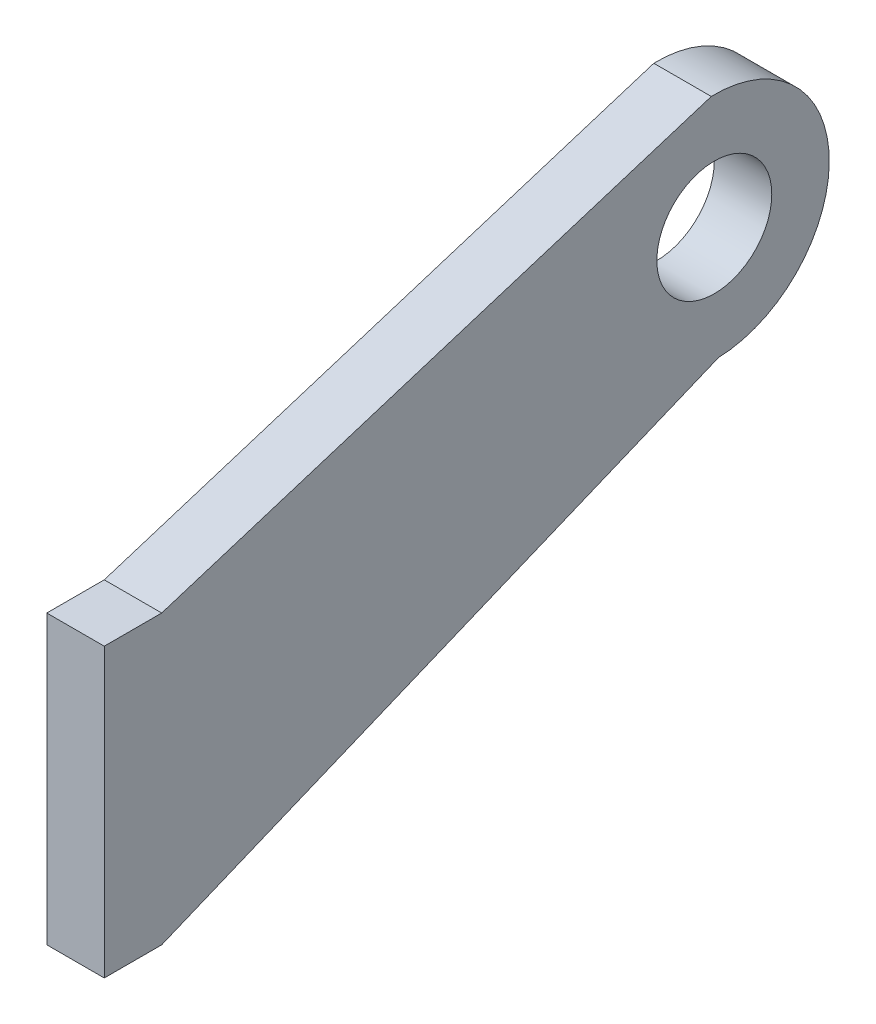
ISO-10303-21;
HEADER;
FILE_DESCRIPTION(('STEP AP214'),'2;1');
FILE_NAME('part.step','',(''),(''),'','','');
FILE_SCHEMA(('AUTOMOTIVE_DESIGN { 1 0 10303 214 1 1 1 1 }'));
ENDSEC;
DATA;
#1=APPLICATION_CONTEXT('core data for automotive mechanical design processes');
#2=APPLICATION_PROTOCOL_DEFINITION('international standard','automotive_design',2000,#1);
#3=PRODUCT_CONTEXT('',#1,'mechanical');
#4=PRODUCT('Part','Part','',(#3));
#5=PRODUCT_RELATED_PRODUCT_CATEGORY('part','',(#4));
#6=PRODUCT_DEFINITION_FORMATION('','',#4);
#7=PRODUCT_DEFINITION_CONTEXT('part definition',#1,'design');
#8=PRODUCT_DEFINITION('design','',#6,#7);
#9=PRODUCT_DEFINITION_SHAPE('','',#8);
#10=(LENGTH_UNIT() NAMED_UNIT(*) SI_UNIT(.MILLI.,.METRE.));
#11=(NAMED_UNIT(*) PLANE_ANGLE_UNIT() SI_UNIT($,.RADIAN.));
#12=(NAMED_UNIT(*) SI_UNIT($,.STERADIAN.) SOLID_ANGLE_UNIT());
#13=UNCERTAINTY_MEASURE_WITH_UNIT(LENGTH_MEASURE(1.E-05),#10,'distance_accuracy_value','');
#14=(GEOMETRIC_REPRESENTATION_CONTEXT(3) GLOBAL_UNCERTAINTY_ASSIGNED_CONTEXT((#13)) GLOBAL_UNIT_ASSIGNED_CONTEXT((#10,
#11,#12)) REPRESENTATION_CONTEXT('',''));
#15=CARTESIAN_POINT('',(0.,0.,0.));
#16=DIRECTION('',(0.,0.,1.));
#17=DIRECTION('',(1.,0.,0.));
#18=AXIS2_PLACEMENT_3D('',#15,#16,#17);
#19=CARTESIAN_POINT('',(2.,6.43294464264585,-19.2252731805383));
#20=DIRECTION('',(1.,0.,0.));
#21=DIRECTION('',(0.,0.,-1.));
#22=AXIS2_PLACEMENT_3D('',#19,#20,#21);
#23=PLANE('',#22);
#24=DIRECTION('',(0.,0.,1.));
#25=VECTOR('',#24,1.);
#26=CARTESIAN_POINT('',(2.,4.42639094895052,0.00360800893894377));
#27=LINE('',#26,#25);
#28=CARTESIAN_POINT('',(2.,4.42639094895052,0.00360800893894377));
#29=VERTEX_POINT('',#28);
#30=CARTESIAN_POINT('',(2.,4.42639094895052,2.00360800893894));
#31=VERTEX_POINT('',#30);
#32=EDGE_CURVE('E129',#29,#31,#27,.T.);
#33=ORIENTED_EDGE('',*,*,#32,.T.);
#34=DIRECTION('',(0.,-1.,0.));
#35=VECTOR('',#34,1.);
#36=CARTESIAN_POINT('',(2.,4.42639094895052,2.00360800893894));
#37=LINE('',#36,#35);
#38=CARTESIAN_POINT('',(2.,-5.57360905104948,2.00360800893894));
#39=VERTEX_POINT('',#38);
#40=EDGE_CURVE('E87',#31,#39,#37,.T.);
#41=ORIENTED_EDGE('',*,*,#40,.T.);
#42=DIRECTION('',(0.,0.,-1.));
#43=VECTOR('',#42,1.);
#44=CARTESIAN_POINT('',(2.,-5.57360905104948,0.00360800893894254));
#45=LINE('',#44,#43);
#46=CARTESIAN_POINT('',(2.,-5.57360905104948,0.00360800893894254));
#47=VERTEX_POINT('',#46);
#48=EDGE_CURVE('E100',#39,#47,#45,.T.);
#49=ORIENTED_EDGE('',*,*,#48,.T.);
#50=DIRECTION('',(0.,0.382054392835845,-0.924139838398299));
#51=VECTOR('',#50,1.);
#52=CARTESIAN_POINT('',(2.,-5.57360905104948,0.00360800893894254));
#53=LINE('',#52,#51);
#54=CARTESIAN_POINT('',(2.,2.435545445332,-19.3694940435041));
#55=VERTEX_POINT('',#54);
#56=EDGE_CURVE('E94',#47,#55,#53,.T.);
#57=ORIENTED_EDGE('',*,*,#56,.T.);
#58=CARTESIAN_POINT('',(2.,6.43294464264585,-19.2252731805383));
#59=DIRECTION('',(1.,0.,0.));
#60=DIRECTION('',(0.,0.,-1.));
#61=AXIS2_PLACEMENT_3D('',#58,#59,#60);
#62=CIRCLE('',#61,4.);
#63=CARTESIAN_POINT('',(2.,10.4315669542121,-19.1202988529884));
#64=VERTEX_POINT('',#63);
#65=EDGE_CURVE('E98',#55,#64,#62,.T.);
#66=ORIENTED_EDGE('',*,*,#65,.T.);
#67=DIRECTION('',(0.,-0.299590726634216,0.95406781546952));
#68=VECTOR('',#67,1.);
#69=CARTESIAN_POINT('',(2.,4.42639094895052,0.00360800893894377));
#70=LINE('',#69,#68);
#71=EDGE_CURVE('E50',#64,#29,#70,.T.);
#72=ORIENTED_EDGE('',*,*,#71,.T.);
#73=EDGE_LOOP('',(#33,#41,#49,#57,#66,#72));
#74=FACE_BOUND('',#73,.T.);
#75=CARTESIAN_POINT('',(2.,6.43294464264585,-19.2252731805383));
#76=DIRECTION('',(1.,0.,0.));
#77=DIRECTION('',(0.,0.,-1.));
#78=AXIS2_PLACEMENT_3D('',#75,#76,#77);
#79=CIRCLE('',#78,2.00000000000001);
#80=CARTESIAN_POINT('',(2.,6.43294464264585,-21.2252731805383));
#81=VERTEX_POINT('',#80);
#82=EDGE_CURVE('E122',#81,#81,#79,.T.);
#83=ORIENTED_EDGE('',*,*,#82,.F.);
#84=EDGE_LOOP('',(#83));
#85=FACE_BOUND('',#84,.T.);
#86=ADVANCED_FACE('F33',(#74,#85),#23,.T.);
#87=CARTESIAN_POINT('',(0.,6.43294464264585,-19.2252731805383));
#88=DIRECTION('',(1.,0.,0.));
#89=DIRECTION('',(0.,0.,-1.));
#90=AXIS2_PLACEMENT_3D('',#87,#88,#89);
#91=PLANE('',#90);
#92=DIRECTION('',(0.,0.,1.));
#93=VECTOR('',#92,1.);
#94=CARTESIAN_POINT('',(0.,4.42639094895052,0.00360800893894377));
#95=LINE('',#94,#93);
#96=CARTESIAN_POINT('',(0.,4.42639094895052,0.00360800893894377));
#97=VERTEX_POINT('',#96);
#98=CARTESIAN_POINT('',(0.,4.42639094895052,2.00360800893894));
#99=VERTEX_POINT('',#98);
#100=EDGE_CURVE('E118',#97,#99,#95,.T.);
#101=ORIENTED_EDGE('',*,*,#100,.F.);
#102=DIRECTION('',(0.,-0.299590726634216,0.95406781546952));
#103=VECTOR('',#102,1.);
#104=CARTESIAN_POINT('',(0.,4.42639094895052,0.00360800893894377));
#105=LINE('',#104,#103);
#106=CARTESIAN_POINT('',(0.,10.4315669542121,-19.1202988529884));
#107=VERTEX_POINT('',#106);
#108=EDGE_CURVE('E79',#107,#97,#105,.T.);
#109=ORIENTED_EDGE('',*,*,#108,.F.);
#110=CARTESIAN_POINT('',(0.,6.43294464264585,-19.2252731805383));
#111=DIRECTION('',(1.,0.,0.));
#112=DIRECTION('',(0.,0.,-1.));
#113=AXIS2_PLACEMENT_3D('',#110,#111,#112);
#114=CIRCLE('',#113,4.);
#115=CARTESIAN_POINT('',(0.,2.435545445332,-19.3694940435041));
#116=VERTEX_POINT('',#115);
#117=EDGE_CURVE('E73',#116,#107,#114,.T.);
#118=ORIENTED_EDGE('',*,*,#117,.F.);
#119=DIRECTION('',(0.,0.382054392835845,-0.924139838398299));
#120=VECTOR('',#119,1.);
#121=CARTESIAN_POINT('',(0.,-5.57360905104948,0.00360800893894254));
#122=LINE('',#121,#120);
#123=CARTESIAN_POINT('',(0.,-5.57360905104948,0.00360800893894254));
#124=VERTEX_POINT('',#123);
#125=EDGE_CURVE('E108',#124,#116,#122,.T.);
#126=ORIENTED_EDGE('',*,*,#125,.F.);
#127=DIRECTION('',(0.,0.,-1.));
#128=VECTOR('',#127,1.);
#129=CARTESIAN_POINT('',(0.,-5.57360905104948,0.00360800893894254));
#130=LINE('',#129,#128);
#131=CARTESIAN_POINT('',(0.,-5.57360905104948,2.00360800893894));
#132=VERTEX_POINT('',#131);
#133=EDGE_CURVE('E124',#132,#124,#130,.T.);
#134=ORIENTED_EDGE('',*,*,#133,.F.);
#135=DIRECTION('',(0.,-1.,0.));
#136=VECTOR('',#135,1.);
#137=CARTESIAN_POINT('',(0.,4.42639094895052,2.00360800893894));
#138=LINE('',#137,#136);
#139=EDGE_CURVE('E121',#99,#132,#138,.T.);
#140=ORIENTED_EDGE('',*,*,#139,.F.);
#141=EDGE_LOOP('',(#101,#109,#118,#126,#134,#140));
#142=FACE_BOUND('',#141,.T.);
#143=CARTESIAN_POINT('',(0.,6.43294464264585,-19.2252731805383));
#144=DIRECTION('',(1.,0.,0.));
#145=DIRECTION('',(0.,0.,-1.));
#146=AXIS2_PLACEMENT_3D('',#143,#144,#145);
#147=CIRCLE('',#146,2.00000000000001);
#148=CARTESIAN_POINT('',(0.,6.43294464264585,-21.2252731805383));
#149=VERTEX_POINT('',#148);
#150=EDGE_CURVE('E222',#149,#149,#147,.T.);
#151=ORIENTED_EDGE('',*,*,#150,.T.);
#152=EDGE_LOOP('',(#151));
#153=FACE_BOUND('',#152,.T.);
#154=ADVANCED_FACE('F138',(#142,#153),#91,.F.);
#155=CARTESIAN_POINT('',(2.,4.42639094895052,0.00360800893894377));
#156=DIRECTION('',(0.,-1.,0.));
#157=DIRECTION('',(0.,0.,-1.));
#158=AXIS2_PLACEMENT_3D('',#155,#156,#157);
#159=PLANE('',#158);
#160=ORIENTED_EDGE('',*,*,#100,.T.);
#161=DIRECTION('',(-1.,0.,0.));
#162=VECTOR('',#161,1.);
#163=CARTESIAN_POINT('',(2.,4.42639094895052,2.00360800893894));
#164=LINE('',#163,#162);
#165=EDGE_CURVE('E11',#31,#99,#164,.T.);
#166=ORIENTED_EDGE('',*,*,#165,.F.);
#167=ORIENTED_EDGE('',*,*,#32,.F.);
#168=DIRECTION('',(-1.,0.,0.));
#169=VECTOR('',#168,1.);
#170=CARTESIAN_POINT('',(2.,4.42639094895052,0.00360800893894377));
#171=LINE('',#170,#169);
#172=EDGE_CURVE('E114',#29,#97,#171,.T.);
#173=ORIENTED_EDGE('',*,*,#172,.T.);
#174=EDGE_LOOP('',(#160,#166,#167,#173));
#175=FACE_BOUND('',#174,.T.);
#176=ADVANCED_FACE('F35',(#175),#159,.F.);
#177=CARTESIAN_POINT('',(2.,4.42639094895052,2.00360800893894));
#178=DIRECTION('',(0.,0.,-1.));
#179=DIRECTION('',(0.,1.,0.));
#180=AXIS2_PLACEMENT_3D('',#177,#178,#179);
#181=PLANE('',#180);
#182=ORIENTED_EDGE('',*,*,#139,.T.);
#183=DIRECTION('',(-1.,0.,0.));
#184=VECTOR('',#183,1.);
#185=CARTESIAN_POINT('',(2.,-5.57360905104948,2.00360800893894));
#186=LINE('',#185,#184);
#187=EDGE_CURVE('E42',#39,#132,#186,.T.);
#188=ORIENTED_EDGE('',*,*,#187,.F.);
#189=ORIENTED_EDGE('',*,*,#40,.F.);
#190=ORIENTED_EDGE('',*,*,#165,.T.);
#191=EDGE_LOOP('',(#182,#188,#189,#190));
#192=FACE_BOUND('',#191,.T.);
#193=ADVANCED_FACE('F163',(#192),#181,.F.);
#194=CARTESIAN_POINT('',(2.,-5.57360905104948,0.00360800893894254));
#195=DIRECTION('',(0.,1.,0.));
#196=DIRECTION('',(0.,0.,1.));
#197=AXIS2_PLACEMENT_3D('',#194,#195,#196);
#198=PLANE('',#197);
#199=ORIENTED_EDGE('',*,*,#133,.T.);
#200=DIRECTION('',(-1.,0.,0.));
#201=VECTOR('',#200,1.);
#202=CARTESIAN_POINT('',(2.,-5.57360905104948,0.00360800893894254));
#203=LINE('',#202,#201);
#204=EDGE_CURVE('E109',#47,#124,#203,.T.);
#205=ORIENTED_EDGE('',*,*,#204,.F.);
#206=ORIENTED_EDGE('',*,*,#48,.F.);
#207=ORIENTED_EDGE('',*,*,#187,.T.);
#208=EDGE_LOOP('',(#199,#205,#206,#207));
#209=FACE_BOUND('',#208,.T.);
#210=ADVANCED_FACE('F135',(#209),#198,.F.);
#211=CARTESIAN_POINT('',(2.,-5.57360905104948,0.00360800893894254));
#212=DIRECTION('',(0.,0.924139838398299,0.382054392835845));
#213=DIRECTION('',(0.,-0.382054392835845,0.924139838398299));
#214=AXIS2_PLACEMENT_3D('',#211,#212,#213);
#215=PLANE('',#214);
#216=ORIENTED_EDGE('',*,*,#125,.T.);
#217=DIRECTION('',(-1.,0.,0.));
#218=VECTOR('',#217,1.);
#219=CARTESIAN_POINT('',(2.,2.435545445332,-19.3694940435041));
#220=LINE('',#219,#218);
#221=EDGE_CURVE('E105',#55,#116,#220,.T.);
#222=ORIENTED_EDGE('',*,*,#221,.F.);
#223=ORIENTED_EDGE('',*,*,#56,.F.);
#224=ORIENTED_EDGE('',*,*,#204,.T.);
#225=EDGE_LOOP('',(#216,#222,#223,#224));
#226=FACE_BOUND('',#225,.T.);
#227=ADVANCED_FACE('F106',(#226),#215,.F.);
#228=CARTESIAN_POINT('',(2.,6.43294464264585,-19.2252731805383));
#229=DIRECTION('',(-1.,0.,0.));
#230=DIRECTION('',(0.,0.,1.));
#231=AXIS2_PLACEMENT_3D('',#228,#229,#230);
#232=CYLINDRICAL_SURFACE('',#231,4.);
#233=ORIENTED_EDGE('',*,*,#117,.T.);
#234=DIRECTION('',(-1.,0.,0.));
#235=VECTOR('',#234,1.);
#236=CARTESIAN_POINT('',(2.,10.4315669542121,-19.1202988529884));
#237=LINE('',#236,#235);
#238=EDGE_CURVE('E110',#64,#107,#237,.T.);
#239=ORIENTED_EDGE('',*,*,#238,.F.);
#240=ORIENTED_EDGE('',*,*,#65,.F.);
#241=ORIENTED_EDGE('',*,*,#221,.T.);
#242=EDGE_LOOP('',(#233,#239,#240,#241));
#243=FACE_BOUND('',#242,.T.);
#244=ADVANCED_FACE('F112',(#243),#232,.T.);
#245=CARTESIAN_POINT('',(2.,4.42639094895052,0.00360800893894377));
#246=DIRECTION('',(0.,-0.95406781546952,-0.299590726634216));
#247=DIRECTION('',(0.,0.299590726634216,-0.95406781546952));
#248=AXIS2_PLACEMENT_3D('',#245,#246,#247);
#249=PLANE('',#248);
#250=ORIENTED_EDGE('',*,*,#108,.T.);
#251=ORIENTED_EDGE('',*,*,#172,.F.);
#252=ORIENTED_EDGE('',*,*,#71,.F.);
#253=ORIENTED_EDGE('',*,*,#238,.T.);
#254=EDGE_LOOP('',(#250,#251,#252,#253));
#255=FACE_BOUND('',#254,.T.);
#256=ADVANCED_FACE('F143',(#255),#249,.F.);
#257=CARTESIAN_POINT('',(2.,6.43294464264585,-19.2252731805383));
#258=DIRECTION('',(-1.,0.,0.));
#259=DIRECTION('',(0.,0.,1.));
#260=AXIS2_PLACEMENT_3D('',#257,#258,#259);
#261=CYLINDRICAL_SURFACE('',#260,2.00000000000001);
#262=ORIENTED_EDGE('',*,*,#82,.T.);
#263=EDGE_LOOP('',(#262));
#264=FACE_BOUND('',#263,.T.);
#265=ORIENTED_EDGE('',*,*,#150,.F.);
#266=EDGE_LOOP('',(#265));
#267=FACE_BOUND('',#266,.T.);
#268=ADVANCED_FACE('F145',(#264,#267),#261,.F.);
#269=CLOSED_SHELL('',(#86,#154,#176,#193,#210,#227,#244,#256,#268));
#270=MANIFOLD_SOLID_BREP('B2',#269);
#271=ADVANCED_BREP_SHAPE_REPRESENTATION('',(#18,#270),#14);
#272=SHAPE_DEFINITION_REPRESENTATION(#9,#271);
ENDSEC;
END-ISO-10303-21;
